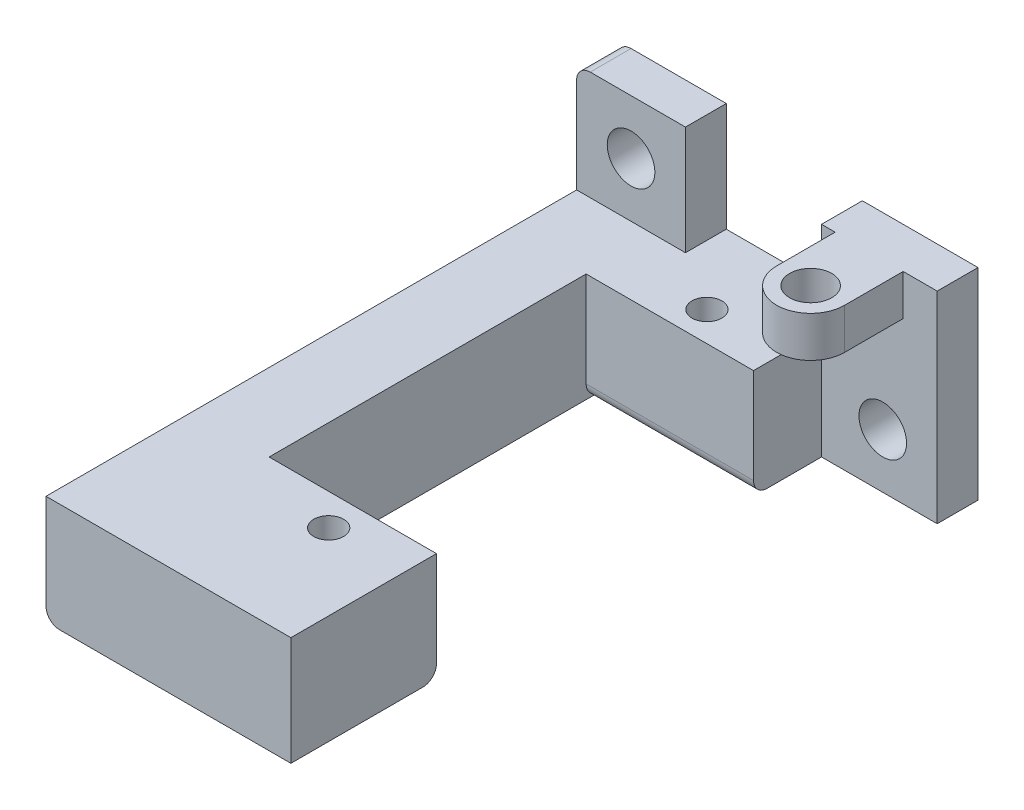
ISO-10303-21;
HEADER;
FILE_DESCRIPTION(('STEP AP214'),'2;1');
FILE_NAME('part.step','',(''),(''),'','','');
FILE_SCHEMA(('AUTOMOTIVE_DESIGN { 1 0 10303 214 1 1 1 1 }'));
ENDSEC;
DATA;
#1=APPLICATION_CONTEXT('core data for automotive mechanical design processes');
#2=APPLICATION_PROTOCOL_DEFINITION('international standard','automotive_design',2000,#1);
#3=PRODUCT_CONTEXT('',#1,'mechanical');
#4=PRODUCT('Part','Part','',(#3));
#5=PRODUCT_RELATED_PRODUCT_CATEGORY('part','',(#4));
#6=PRODUCT_DEFINITION_FORMATION('','',#4);
#7=PRODUCT_DEFINITION_CONTEXT('part definition',#1,'design');
#8=PRODUCT_DEFINITION('design','',#6,#7);
#9=PRODUCT_DEFINITION_SHAPE('','',#8);
#10=(LENGTH_UNIT() NAMED_UNIT(*) SI_UNIT(.MILLI.,.METRE.));
#11=(NAMED_UNIT(*) PLANE_ANGLE_UNIT() SI_UNIT($,.RADIAN.));
#12=(NAMED_UNIT(*) SI_UNIT($,.STERADIAN.) SOLID_ANGLE_UNIT());
#13=UNCERTAINTY_MEASURE_WITH_UNIT(LENGTH_MEASURE(1.E-05),#10,'distance_accuracy_value','');
#14=(GEOMETRIC_REPRESENTATION_CONTEXT(3) GLOBAL_UNCERTAINTY_ASSIGNED_CONTEXT((#13)) GLOBAL_UNIT_ASSIGNED_CONTEXT((#10,
#11,#12)) REPRESENTATION_CONTEXT('',''));
#15=CARTESIAN_POINT('',(0.,0.,0.));
#16=DIRECTION('',(0.,0.,1.));
#17=DIRECTION('',(1.,0.,0.));
#18=AXIS2_PLACEMENT_3D('',#15,#16,#17);
#19=CARTESIAN_POINT('',(0.,0.,-19.));
#20=DIRECTION('',(0.,0.,1.));
#21=DIRECTION('',(-1.,0.,0.));
#22=AXIS2_PLACEMENT_3D('',#19,#20,#21);
#23=PLANE('',#22);
#24=DIRECTION('',(0.,1.,0.));
#25=VECTOR('',#24,1.);
#26=CARTESIAN_POINT('',(17.5,-4.,-19.));
#27=LINE('',#26,#25);
#28=CARTESIAN_POINT('',(17.5,-4.,-19.));
#29=VERTEX_POINT('',#28);
#30=CARTESIAN_POINT('',(17.5,10.81,-19.));
#31=VERTEX_POINT('',#30);
#32=EDGE_CURVE('E213',#29,#31,#27,.T.);
#33=ORIENTED_EDGE('',*,*,#32,.T.);
#34=DIRECTION('',(1.,0.,0.));
#35=VECTOR('',#34,1.);
#36=CARTESIAN_POINT('',(20.,10.81,-19.));
#37=LINE('',#36,#35);
#38=CARTESIAN_POINT('',(15.,10.81,-19.));
#39=VERTEX_POINT('',#38);
#40=EDGE_CURVE('E201',#39,#31,#37,.T.);
#41=ORIENTED_EDGE('',*,*,#40,.F.);
#42=DIRECTION('',(0.,1.,0.));
#43=VECTOR('',#42,1.);
#44=CARTESIAN_POINT('',(15.,0.,-19.));
#45=LINE('',#44,#43);
#46=CARTESIAN_POINT('',(15.,7.81,-19.));
#47=VERTEX_POINT('',#46);
#48=EDGE_CURVE('E472',#47,#39,#45,.T.);
#49=ORIENTED_EDGE('',*,*,#48,.F.);
#50=DIRECTION('',(1.,0.,0.));
#51=VECTOR('',#50,1.);
#52=CARTESIAN_POINT('',(0.,7.81,-19.));
#53=LINE('',#52,#51);
#54=CARTESIAN_POINT('',(9.99999999999999,7.81,-19.));
#55=VERTEX_POINT('',#54);
#56=EDGE_CURVE('E231',#55,#47,#53,.T.);
#57=ORIENTED_EDGE('',*,*,#56,.F.);
#58=DIRECTION('',(0.,-1.,0.));
#59=VECTOR('',#58,1.);
#60=CARTESIAN_POINT('',(9.99999999999999,0.,-19.));
#61=LINE('',#60,#59);
#62=CARTESIAN_POINT('',(9.99999999999999,10.81,-19.));
#63=VERTEX_POINT('',#62);
#64=EDGE_CURVE('E475',#63,#55,#61,.T.);
#65=ORIENTED_EDGE('',*,*,#64,.F.);
#66=CARTESIAN_POINT('',(9.,10.81,-19.));
#67=VERTEX_POINT('',#66);
#68=EDGE_CURVE('E232',#67,#63,#37,.T.);
#69=ORIENTED_EDGE('',*,*,#68,.F.);
#70=DIRECTION('',(0.,1.,0.));
#71=VECTOR('',#70,1.);
#72=CARTESIAN_POINT('',(9.,4.,-19.));
#73=LINE('',#72,#71);
#74=CARTESIAN_POINT('',(9.,4.,-19.));
#75=VERTEX_POINT('',#74);
#76=EDGE_CURVE('E228',#75,#67,#73,.T.);
#77=ORIENTED_EDGE('',*,*,#76,.F.);
#78=DIRECTION('',(0.,-1.,0.));
#79=VECTOR('',#78,1.);
#80=CARTESIAN_POINT('',(9.,4.,-19.));
#81=LINE('',#80,#79);
#82=CARTESIAN_POINT('',(9.,-4.,-19.));
#83=VERTEX_POINT('',#82);
#84=EDGE_CURVE('E266',#75,#83,#81,.T.);
#85=ORIENTED_EDGE('',*,*,#84,.T.);
#86=DIRECTION('',(1.,0.,0.));
#87=VECTOR('',#86,1.);
#88=CARTESIAN_POINT('',(-9.,-4.,-19.));
#89=LINE('',#88,#87);
#90=EDGE_CURVE('E255',#83,#29,#89,.T.);
#91=ORIENTED_EDGE('',*,*,#90,.T.);
#92=EDGE_LOOP('',(#33,#41,#49,#57,#65,#69,#77,#85,#91));
#93=FACE_BOUND('',#92,.T.);
#94=CARTESIAN_POINT('',(13.5,0.,-19.));
#95=DIRECTION('',(0.,0.,-1.));
#96=DIRECTION('',(-1.,0.,0.));
#97=AXIS2_PLACEMENT_3D('',#94,#95,#96);
#98=CIRCLE('',#97,1.75);
#99=CARTESIAN_POINT('',(11.75,0.,-19.));
#100=VERTEX_POINT('',#99);
#101=EDGE_CURVE('E429',#100,#100,#98,.T.);
#102=ORIENTED_EDGE('',*,*,#101,.T.);
#103=EDGE_LOOP('',(#102));
#104=FACE_BOUND('',#103,.T.);
#105=ADVANCED_FACE('F39',(#93,#104),#23,.T.);
#106=CARTESIAN_POINT('',(0.,4.,-14.));
#107=DIRECTION('',(0.,0.,-1.));
#108=DIRECTION('',(1.,0.,0.));
#109=AXIS2_PLACEMENT_3D('',#106,#107,#108);
#110=PLANE('',#109);
#111=DIRECTION('',(0.,-1.,0.));
#112=VECTOR('',#111,1.);
#113=CARTESIAN_POINT('',(9.,4.,-14.));
#114=LINE('',#113,#112);
#115=CARTESIAN_POINT('',(9.,4.,-14.));
#116=VERTEX_POINT('',#115);
#117=CARTESIAN_POINT('',(9.,-3.,-14.));
#118=VERTEX_POINT('',#117);
#119=EDGE_CURVE('E294',#116,#118,#114,.T.);
#120=ORIENTED_EDGE('',*,*,#119,.F.);
#121=DIRECTION('',(-1.,0.,0.));
#122=VECTOR('',#121,1.);
#123=CARTESIAN_POINT('',(0.,4.,-14.));
#124=LINE('',#123,#122);
#125=CARTESIAN_POINT('',(-3.3,4.,-14.));
#126=VERTEX_POINT('',#125);
#127=EDGE_CURVE('E270',#116,#126,#124,.T.);
#128=ORIENTED_EDGE('',*,*,#127,.T.);
#129=DIRECTION('',(0.,-1.,0.));
#130=VECTOR('',#129,1.);
#131=CARTESIAN_POINT('',(-3.3,4.,-14.));
#132=LINE('',#131,#130);
#133=CARTESIAN_POINT('',(-3.3,-3.,-14.));
#134=VERTEX_POINT('',#133);
#135=EDGE_CURVE('E308',#126,#134,#132,.T.);
#136=ORIENTED_EDGE('',*,*,#135,.T.);
#137=DIRECTION('',(-1.,0.,0.));
#138=VECTOR('',#137,1.);
#139=CARTESIAN_POINT('',(0.,-3.,-14.));
#140=LINE('',#139,#138);
#141=EDGE_CURVE('E331',#118,#134,#140,.T.);
#142=ORIENTED_EDGE('',*,*,#141,.F.);
#143=EDGE_LOOP('',(#120,#128,#136,#142));
#144=FACE_BOUND('',#143,.T.);
#145=ADVANCED_FACE('F361',(#144),#110,.F.);
#146=CARTESIAN_POINT('',(-3.3,4.,0.));
#147=DIRECTION('',(-1.,0.,0.));
#148=DIRECTION('',(0.,0.,-1.));
#149=AXIS2_PLACEMENT_3D('',#146,#147,#148);
#150=PLANE('',#149);
#151=DIRECTION('',(0.,0.,1.));
#152=VECTOR('',#151,1.);
#153=CARTESIAN_POINT('',(-3.3,-4.,0.));
#154=LINE('',#153,#152);
#155=CARTESIAN_POINT('',(-3.3,-4.,-15.));
#156=VERTEX_POINT('',#155);
#157=CARTESIAN_POINT('',(-3.3,-4.,10.3));
#158=VERTEX_POINT('',#157);
#159=EDGE_CURVE('E269',#156,#158,#154,.T.);
#160=ORIENTED_EDGE('',*,*,#159,.F.);
#161=CARTESIAN_POINT('',(-3.3,-3.,-15.));
#162=DIRECTION('',(1.,0.,0.));
#163=DIRECTION('',(0.,0.,-1.));
#164=AXIS2_PLACEMENT_3D('',#161,#162,#163);
#165=CIRCLE('',#164,1.);
#166=EDGE_CURVE('E47',#134,#156,#165,.T.);
#167=ORIENTED_EDGE('',*,*,#166,.F.);
#168=ORIENTED_EDGE('',*,*,#135,.F.);
#169=DIRECTION('',(0.,0.,1.));
#170=VECTOR('',#169,1.);
#171=CARTESIAN_POINT('',(-3.3,4.,0.));
#172=LINE('',#171,#170);
#173=CARTESIAN_POINT('',(-3.3,4.,9.3));
#174=VERTEX_POINT('',#173);
#175=EDGE_CURVE('E273',#126,#174,#172,.T.);
#176=ORIENTED_EDGE('',*,*,#175,.T.);
#177=DIRECTION('',(0.,-1.,0.));
#178=VECTOR('',#177,1.);
#179=CARTESIAN_POINT('',(-3.3,4.,9.3));
#180=LINE('',#179,#178);
#181=CARTESIAN_POINT('',(-3.3,-3.,9.3));
#182=VERTEX_POINT('',#181);
#183=EDGE_CURVE('E305',#174,#182,#180,.T.);
#184=ORIENTED_EDGE('',*,*,#183,.T.);
#185=CARTESIAN_POINT('',(-3.3,-3.,10.3));
#186=DIRECTION('',(1.,0.,0.));
#187=DIRECTION('',(0.,0.,-1.));
#188=AXIS2_PLACEMENT_3D('',#185,#186,#187);
#189=CIRCLE('',#188,1.);
#190=EDGE_CURVE('E11',#158,#182,#189,.T.);
#191=ORIENTED_EDGE('',*,*,#190,.F.);
#192=EDGE_LOOP('',(#160,#167,#168,#176,#184,#191));
#193=FACE_BOUND('',#192,.T.);
#194=ADVANCED_FACE('F350',(#193),#150,.F.);
#195=CARTESIAN_POINT('',(0.,4.,9.3));
#196=DIRECTION('',(0.,0.,-1.));
#197=DIRECTION('',(1.,0.,0.));
#198=AXIS2_PLACEMENT_3D('',#195,#196,#197);
#199=PLANE('',#198);
#200=ORIENTED_EDGE('',*,*,#183,.F.);
#201=DIRECTION('',(-1.,0.,0.));
#202=VECTOR('',#201,1.);
#203=CARTESIAN_POINT('',(0.,4.,9.3));
#204=LINE('',#203,#202);
#205=CARTESIAN_POINT('',(9.,4.,9.3));
#206=VERTEX_POINT('',#205);
#207=EDGE_CURVE('E277',#206,#174,#204,.T.);
#208=ORIENTED_EDGE('',*,*,#207,.F.);
#209=DIRECTION('',(0.,-1.,0.));
#210=VECTOR('',#209,1.);
#211=CARTESIAN_POINT('',(9.,4.,9.3));
#212=LINE('',#211,#210);
#213=CARTESIAN_POINT('',(9.,-3.,9.3));
#214=VERTEX_POINT('',#213);
#215=EDGE_CURVE('E303',#206,#214,#212,.T.);
#216=ORIENTED_EDGE('',*,*,#215,.T.);
#217=DIRECTION('',(-1.,0.,0.));
#218=VECTOR('',#217,1.);
#219=CARTESIAN_POINT('',(9.,-3.,9.3));
#220=LINE('',#219,#218);
#221=EDGE_CURVE('E54',#182,#214,#220,.F.);
#222=ORIENTED_EDGE('',*,*,#221,.F.);
#223=EDGE_LOOP('',(#200,#208,#216,#222));
#224=FACE_BOUND('',#223,.T.);
#225=ADVANCED_FACE('F368',(#224),#199,.T.);
#226=CARTESIAN_POINT('',(9.,4.,0.));
#227=DIRECTION('',(-1.,0.,0.));
#228=DIRECTION('',(0.,0.,-1.));
#229=AXIS2_PLACEMENT_3D('',#226,#227,#228);
#230=PLANE('',#229);
#231=ORIENTED_EDGE('',*,*,#215,.F.);
#232=DIRECTION('',(0.,0.,1.));
#233=VECTOR('',#232,1.);
#234=CARTESIAN_POINT('',(9.,4.,0.));
#235=LINE('',#234,#233);
#236=CARTESIAN_POINT('',(9.,4.,20.));
#237=VERTEX_POINT('',#236);
#238=EDGE_CURVE('E279',#206,#237,#235,.T.);
#239=ORIENTED_EDGE('',*,*,#238,.T.);
#240=DIRECTION('',(0.,-1.,0.));
#241=VECTOR('',#240,1.);
#242=CARTESIAN_POINT('',(9.,4.,20.));
#243=LINE('',#242,#241);
#244=CARTESIAN_POINT('',(9.,-4.,20.));
#245=VERTEX_POINT('',#244);
#246=EDGE_CURVE('E300',#237,#245,#243,.T.);
#247=ORIENTED_EDGE('',*,*,#246,.T.);
#248=DIRECTION('',(0.,0.,1.));
#249=VECTOR('',#248,1.);
#250=CARTESIAN_POINT('',(9.,-4.,0.));
#251=LINE('',#250,#249);
#252=CARTESIAN_POINT('',(9.,-4.,10.3));
#253=VERTEX_POINT('',#252);
#254=EDGE_CURVE('E289',#253,#245,#251,.T.);
#255=ORIENTED_EDGE('',*,*,#254,.F.);
#256=CARTESIAN_POINT('',(9.,-3.,10.3));
#257=DIRECTION('',(1.,0.,0.));
#258=DIRECTION('',(0.,0.,-1.));
#259=AXIS2_PLACEMENT_3D('',#256,#257,#258);
#260=CIRCLE('',#259,1.);
#261=EDGE_CURVE('E61',#214,#253,#260,.F.);
#262=ORIENTED_EDGE('',*,*,#261,.F.);
#263=EDGE_LOOP('',(#231,#239,#247,#255,#262));
#264=FACE_BOUND('',#263,.T.);
#265=ADVANCED_FACE('F370',(#264),#230,.F.);
#266=CARTESIAN_POINT('',(0.,4.,20.));
#267=DIRECTION('',(0.,0.,1.));
#268=DIRECTION('',(-1.,0.,0.));
#269=AXIS2_PLACEMENT_3D('',#266,#267,#268);
#270=PLANE('',#269);
#271=DIRECTION('',(1.,0.,0.));
#272=VECTOR('',#271,1.);
#273=CARTESIAN_POINT('',(0.,-4.,20.));
#274=LINE('',#273,#272);
#275=CARTESIAN_POINT('',(-8.,-4.,20.));
#276=VERTEX_POINT('',#275);
#277=EDGE_CURVE('E292',#276,#245,#274,.T.);
#278=ORIENTED_EDGE('',*,*,#277,.T.);
#279=ORIENTED_EDGE('',*,*,#246,.F.);
#280=DIRECTION('',(1.,0.,0.));
#281=VECTOR('',#280,1.);
#282=CARTESIAN_POINT('',(0.,4.,20.));
#283=LINE('',#282,#281);
#284=CARTESIAN_POINT('',(-9.,4.,20.));
#285=VERTEX_POINT('',#284);
#286=EDGE_CURVE('E282',#285,#237,#283,.T.);
#287=ORIENTED_EDGE('',*,*,#286,.F.);
#288=DIRECTION('',(0.,-1.,0.));
#289=VECTOR('',#288,1.);
#290=CARTESIAN_POINT('',(-9.,4.,20.));
#291=LINE('',#290,#289);
#292=CARTESIAN_POINT('',(-9.,-3.,20.));
#293=VERTEX_POINT('',#292);
#294=EDGE_CURVE('E297',#285,#293,#291,.T.);
#295=ORIENTED_EDGE('',*,*,#294,.T.);
#296=CARTESIAN_POINT('',(-8.,-3.,20.));
#297=DIRECTION('',(0.,0.,-1.));
#298=DIRECTION('',(-1.,0.,0.));
#299=AXIS2_PLACEMENT_3D('',#296,#297,#298);
#300=CIRCLE('',#299,1.);
#301=EDGE_CURVE('E313',#276,#293,#300,.T.);
#302=ORIENTED_EDGE('',*,*,#301,.F.);
#303=EDGE_LOOP('',(#278,#279,#287,#295,#302));
#304=FACE_BOUND('',#303,.T.);
#305=ADVANCED_FACE('F376',(#304),#270,.T.);
#306=CARTESIAN_POINT('',(-9.,4.,0.));
#307=DIRECTION('',(-1.,0.,0.));
#308=DIRECTION('',(0.,0.,-1.));
#309=AXIS2_PLACEMENT_3D('',#306,#307,#308);
#310=PLANE('',#309);
#311=ORIENTED_EDGE('',*,*,#294,.F.);
#312=DIRECTION('',(0.,0.,1.));
#313=VECTOR('',#312,1.);
#314=CARTESIAN_POINT('',(-9.,4.,0.));
#315=LINE('',#314,#313);
#316=CARTESIAN_POINT('',(-9.,4.,-19.));
#317=VERTEX_POINT('',#316);
#318=EDGE_CURVE('E285',#317,#285,#315,.T.);
#319=ORIENTED_EDGE('',*,*,#318,.F.);
#320=DIRECTION('',(0.,-1.,0.));
#321=VECTOR('',#320,1.);
#322=CARTESIAN_POINT('',(-9.,-4.,-19.));
#323=LINE('',#322,#321);
#324=CARTESIAN_POINT('',(-9.,11.,-19.));
#325=VERTEX_POINT('',#324);
#326=EDGE_CURVE('E252',#325,#317,#323,.T.);
#327=ORIENTED_EDGE('',*,*,#326,.F.);
#328=DIRECTION('',(0.,0.,-1.));
#329=VECTOR('',#328,1.);
#330=CARTESIAN_POINT('',(-9.,11.,0.));
#331=LINE('',#330,#329);
#332=CARTESIAN_POINT('',(-9.,11.,-22.));
#333=VERTEX_POINT('',#332);
#334=EDGE_CURVE('E316',#333,#325,#331,.F.);
#335=ORIENTED_EDGE('',*,*,#334,.F.);
#336=DIRECTION('',(0.,-1.,0.));
#337=VECTOR('',#336,1.);
#338=CARTESIAN_POINT('',(-9.,-4.,-22.));
#339=LINE('',#338,#337);
#340=CARTESIAN_POINT('',(-9.,-3.,-22.));
#341=VERTEX_POINT('',#340);
#342=EDGE_CURVE('E242',#333,#341,#339,.T.);
#343=ORIENTED_EDGE('',*,*,#342,.T.);
#344=DIRECTION('',(0.,0.,1.));
#345=VECTOR('',#344,1.);
#346=CARTESIAN_POINT('',(-9.,-3.,-22.));
#347=LINE('',#346,#345);
#348=EDGE_CURVE('E319',#293,#341,#347,.F.);
#349=ORIENTED_EDGE('',*,*,#348,.F.);
#350=EDGE_LOOP('',(#311,#319,#327,#335,#343,#349));
#351=FACE_BOUND('',#350,.T.);
#352=ADVANCED_FACE('F413',(#351),#310,.T.);
#353=CARTESIAN_POINT('',(9.,-4.,-15.));
#354=VERTEX_POINT('',#353);
#355=EDGE_CURVE('E274',#83,#354,#251,.T.);
#356=ORIENTED_EDGE('',*,*,#355,.F.);
#357=ORIENTED_EDGE('',*,*,#84,.F.);
#358=EDGE_CURVE('E283',#75,#116,#235,.T.);
#359=ORIENTED_EDGE('',*,*,#358,.T.);
#360=ORIENTED_EDGE('',*,*,#119,.T.);
#361=CARTESIAN_POINT('',(9.,-3.,-15.));
#362=DIRECTION('',(1.,0.,0.));
#363=DIRECTION('',(0.,0.,-1.));
#364=AXIS2_PLACEMENT_3D('',#361,#362,#363);
#365=CIRCLE('',#364,1.);
#366=EDGE_CURVE('E338',#354,#118,#365,.F.);
#367=ORIENTED_EDGE('',*,*,#366,.F.);
#368=EDGE_LOOP('',(#356,#357,#359,#360,#367));
#369=FACE_BOUND('',#368,.T.);
#370=ADVANCED_FACE('F357',(#369),#230,.F.);
#371=CARTESIAN_POINT('',(0.,4.,0.));
#372=DIRECTION('',(0.,1.,0.));
#373=DIRECTION('',(0.,0.,-1.));
#374=AXIS2_PLACEMENT_3D('',#371,#372,#373);
#375=PLANE('',#374);
#376=CARTESIAN_POINT('',(3.4,4.,11.6230588166172));
#377=DIRECTION('',(0.,-1.,0.));
#378=DIRECTION('',(0.,0.,-1.));
#379=AXIS2_PLACEMENT_3D('',#376,#377,#378);
#380=CIRCLE('',#379,1.1);
#381=CARTESIAN_POINT('',(3.4,4.,10.5230588166172));
#382=VERTEX_POINT('',#381);
#383=EDGE_CURVE('E431',#382,#382,#380,.T.);
#384=ORIENTED_EDGE('',*,*,#383,.T.);
#385=EDGE_LOOP('',(#384));
#386=FACE_BOUND('',#385,.T.);
#387=CARTESIAN_POINT('',(3.4,4.,-16.1769411833828));
#388=DIRECTION('',(0.,-1.,0.));
#389=DIRECTION('',(0.,0.,-1.));
#390=AXIS2_PLACEMENT_3D('',#387,#388,#389);
#391=CIRCLE('',#390,1.1);
#392=CARTESIAN_POINT('',(3.4,4.,-17.2769411833828));
#393=VERTEX_POINT('',#392);
#394=EDGE_CURVE('E434',#393,#393,#391,.T.);
#395=ORIENTED_EDGE('',*,*,#394,.T.);
#396=EDGE_LOOP('',(#395));
#397=FACE_BOUND('',#396,.T.);
#398=DIRECTION('',(0.,0.,1.));
#399=VECTOR('',#398,1.);
#400=CARTESIAN_POINT('',(9.,4.,-34.9373915454391));
#401=LINE('',#400,#399);
#402=CARTESIAN_POINT('',(9.,4.,-22.));
#403=VERTEX_POINT('',#402);
#404=EDGE_CURVE('E235',#403,#75,#401,.T.);
#405=ORIENTED_EDGE('',*,*,#404,.F.);
#406=DIRECTION('',(-1.,0.,0.));
#407=VECTOR('',#406,1.);
#408=CARTESIAN_POINT('',(-1.,4.,-22.));
#409=LINE('',#408,#407);
#410=CARTESIAN_POINT('',(-1.,4.,-22.));
#411=VERTEX_POINT('',#410);
#412=EDGE_CURVE('E219',#403,#411,#409,.T.);
#413=ORIENTED_EDGE('',*,*,#412,.T.);
#414=DIRECTION('',(0.,0.,-1.));
#415=VECTOR('',#414,1.);
#416=CARTESIAN_POINT('',(-1.,4.,-19.));
#417=LINE('',#416,#415);
#418=CARTESIAN_POINT('',(-1.,4.,-19.));
#419=VERTEX_POINT('',#418);
#420=EDGE_CURVE('E258',#419,#411,#417,.T.);
#421=ORIENTED_EDGE('',*,*,#420,.F.);
#422=DIRECTION('',(-1.,0.,0.));
#423=VECTOR('',#422,1.);
#424=CARTESIAN_POINT('',(0.,4.,-19.));
#425=LINE('',#424,#423);
#426=EDGE_CURVE('E262',#419,#317,#425,.T.);
#427=ORIENTED_EDGE('',*,*,#426,.T.);
#428=ORIENTED_EDGE('',*,*,#318,.T.);
#429=ORIENTED_EDGE('',*,*,#286,.T.);
#430=ORIENTED_EDGE('',*,*,#238,.F.);
#431=ORIENTED_EDGE('',*,*,#207,.T.);
#432=ORIENTED_EDGE('',*,*,#175,.F.);
#433=ORIENTED_EDGE('',*,*,#127,.F.);
#434=ORIENTED_EDGE('',*,*,#358,.F.);
#435=EDGE_LOOP('',(#405,#413,#421,#427,#428,#429,#430,#431,#432,#433,#434));
#436=FACE_BOUND('',#435,.T.);
#437=ADVANCED_FACE('F365',(#386,#397,#436),#375,.T.);
#438=CARTESIAN_POINT('',(0.,-4.,0.));
#439=DIRECTION('',(0.,1.,0.));
#440=DIRECTION('',(0.,0.,-1.));
#441=AXIS2_PLACEMENT_3D('',#438,#439,#440);
#442=PLANE('',#441);
#443=CARTESIAN_POINT('',(3.4,-4.,11.6230588166172));
#444=DIRECTION('',(0.,1.,0.));
#445=DIRECTION('',(0.,0.,1.));
#446=AXIS2_PLACEMENT_3D('',#443,#444,#445);
#447=CIRCLE('',#446,1.1);
#448=CARTESIAN_POINT('',(3.4,-4.,12.7230588166172));
#449=VERTEX_POINT('',#448);
#450=EDGE_CURVE('E539',#449,#449,#447,.T.);
#451=ORIENTED_EDGE('',*,*,#450,.T.);
#452=EDGE_LOOP('',(#451));
#453=FACE_BOUND('',#452,.T.);
#454=CARTESIAN_POINT('',(3.4,-4.,-16.1769411833828));
#455=DIRECTION('',(0.,1.,0.));
#456=DIRECTION('',(0.,0.,1.));
#457=AXIS2_PLACEMENT_3D('',#454,#455,#456);
#458=CIRCLE('',#457,1.1);
#459=CARTESIAN_POINT('',(3.4,-4.,-15.0769411833828));
#460=VERTEX_POINT('',#459);
#461=EDGE_CURVE('E541',#460,#460,#458,.T.);
#462=ORIENTED_EDGE('',*,*,#461,.T.);
#463=EDGE_LOOP('',(#462));
#464=FACE_BOUND('',#463,.T.);
#465=ORIENTED_EDGE('',*,*,#159,.T.);
#466=DIRECTION('',(-1.,0.,0.));
#467=VECTOR('',#466,1.);
#468=CARTESIAN_POINT('',(-3.3,-4.,10.3));
#469=LINE('',#468,#467);
#470=EDGE_CURVE('E334',#253,#158,#469,.T.);
#471=ORIENTED_EDGE('',*,*,#470,.F.);
#472=ORIENTED_EDGE('',*,*,#254,.T.);
#473=ORIENTED_EDGE('',*,*,#277,.F.);
#474=DIRECTION('',(0.,0.,1.));
#475=VECTOR('',#474,1.);
#476=CARTESIAN_POINT('',(-8.,-4.,20.));
#477=LINE('',#476,#475);
#478=CARTESIAN_POINT('',(-8.,-4.,-22.));
#479=VERTEX_POINT('',#478);
#480=EDGE_CURVE('E311',#479,#276,#477,.T.);
#481=ORIENTED_EDGE('',*,*,#480,.F.);
#482=DIRECTION('',(1.,0.,0.));
#483=VECTOR('',#482,1.);
#484=CARTESIAN_POINT('',(-9.,-4.,-22.));
#485=LINE('',#484,#483);
#486=CARTESIAN_POINT('',(17.5,-4.,-22.));
#487=VERTEX_POINT('',#486);
#488=EDGE_CURVE('E245',#479,#487,#485,.T.);
#489=ORIENTED_EDGE('',*,*,#488,.T.);
#490=DIRECTION('',(0.,0.,1.));
#491=VECTOR('',#490,1.);
#492=CARTESIAN_POINT('',(17.5,-4.,-22.));
#493=LINE('',#492,#491);
#494=EDGE_CURVE('E205',#487,#29,#493,.T.);
#495=ORIENTED_EDGE('',*,*,#494,.T.);
#496=ORIENTED_EDGE('',*,*,#90,.F.);
#497=ORIENTED_EDGE('',*,*,#355,.T.);
#498=DIRECTION('',(-1.,0.,0.));
#499=VECTOR('',#498,1.);
#500=CARTESIAN_POINT('',(0.,-4.,-15.));
#501=LINE('',#500,#499);
#502=EDGE_CURVE('E336',#156,#354,#501,.F.);
#503=ORIENTED_EDGE('',*,*,#502,.F.);
#504=EDGE_LOOP('',(#465,#471,#472,#473,#481,#489,#495,#496,#497,#503));
#505=FACE_BOUND('',#504,.T.);
#506=ADVANCED_FACE('F352',(#453,#464,#505),#442,.F.);
#507=CARTESIAN_POINT('',(-9.,12.,-19.));
#508=DIRECTION('',(0.,1.,0.));
#509=DIRECTION('',(0.,0.,-1.));
#510=AXIS2_PLACEMENT_3D('',#507,#508,#509);
#511=PLANE('',#510);
#512=DIRECTION('',(-1.,0.,0.));
#513=VECTOR('',#512,1.);
#514=CARTESIAN_POINT('',(-9.,12.,-19.));
#515=LINE('',#514,#513);
#516=CARTESIAN_POINT('',(-1.,12.,-19.));
#517=VERTEX_POINT('',#516);
#518=CARTESIAN_POINT('',(-8.,12.,-19.));
#519=VERTEX_POINT('',#518);
#520=EDGE_CURVE('E249',#517,#519,#515,.T.);
#521=ORIENTED_EDGE('',*,*,#520,.F.);
#522=DIRECTION('',(0.,0.,-1.));
#523=VECTOR('',#522,1.);
#524=CARTESIAN_POINT('',(-1.,12.,-19.));
#525=LINE('',#524,#523);
#526=CARTESIAN_POINT('',(-1.,12.,-22.));
#527=VERTEX_POINT('',#526);
#528=EDGE_CURVE('E259',#517,#527,#525,.T.);
#529=ORIENTED_EDGE('',*,*,#528,.T.);
#530=DIRECTION('',(-1.,0.,0.));
#531=VECTOR('',#530,1.);
#532=CARTESIAN_POINT('',(-9.,12.,-22.));
#533=LINE('',#532,#531);
#534=CARTESIAN_POINT('',(-8.,12.,-22.));
#535=VERTEX_POINT('',#534);
#536=EDGE_CURVE('E239',#527,#535,#533,.T.);
#537=ORIENTED_EDGE('',*,*,#536,.T.);
#538=DIRECTION('',(0.,0.,-1.));
#539=VECTOR('',#538,1.);
#540=CARTESIAN_POINT('',(-8.,12.,-19.));
#541=LINE('',#540,#539);
#542=EDGE_CURVE('E326',#519,#535,#541,.T.);
#543=ORIENTED_EDGE('',*,*,#542,.F.);
#544=EDGE_LOOP('',(#521,#529,#537,#543));
#545=FACE_BOUND('',#544,.T.);
#546=ADVANCED_FACE('F399',(#545),#511,.T.);
#547=CARTESIAN_POINT('',(-1.,4.,-19.));
#548=DIRECTION('',(1.,0.,0.));
#549=DIRECTION('',(0.,0.,1.));
#550=AXIS2_PLACEMENT_3D('',#547,#548,#549);
#551=PLANE('',#550);
#552=ORIENTED_EDGE('',*,*,#528,.F.);
#553=DIRECTION('',(0.,1.,0.));
#554=VECTOR('',#553,1.);
#555=CARTESIAN_POINT('',(-1.,4.,-19.));
#556=LINE('',#555,#554);
#557=EDGE_CURVE('E247',#419,#517,#556,.T.);
#558=ORIENTED_EDGE('',*,*,#557,.F.);
#559=ORIENTED_EDGE('',*,*,#420,.T.);
#560=DIRECTION('',(0.,1.,0.));
#561=VECTOR('',#560,1.);
#562=CARTESIAN_POINT('',(-1.,4.,-22.));
#563=LINE('',#562,#561);
#564=EDGE_CURVE('E222',#411,#527,#563,.T.);
#565=ORIENTED_EDGE('',*,*,#564,.T.);
#566=EDGE_LOOP('',(#552,#558,#559,#565));
#567=FACE_BOUND('',#566,.T.);
#568=ADVANCED_FACE('F392',(#567),#551,.T.);
#569=CARTESIAN_POINT('',(-5.,8.,-19.));
#570=DIRECTION('',(0.,0.,-1.));
#571=DIRECTION('',(-1.,0.,0.));
#572=AXIS2_PLACEMENT_3D('',#569,#570,#571);
#573=CIRCLE('',#572,1.75);
#574=CARTESIAN_POINT('',(-6.75,8.,-19.));
#575=VERTEX_POINT('',#574);
#576=EDGE_CURVE('E405',#575,#575,#573,.T.);
#577=ORIENTED_EDGE('',*,*,#576,.T.);
#578=EDGE_LOOP('',(#577));
#579=FACE_BOUND('',#578,.T.);
#580=ORIENTED_EDGE('',*,*,#326,.T.);
#581=ORIENTED_EDGE('',*,*,#426,.F.);
#582=ORIENTED_EDGE('',*,*,#557,.T.);
#583=ORIENTED_EDGE('',*,*,#520,.T.);
#584=CARTESIAN_POINT('',(-8.,11.,-19.));
#585=DIRECTION('',(0.,0.,-1.));
#586=DIRECTION('',(-1.,0.,0.));
#587=AXIS2_PLACEMENT_3D('',#584,#585,#586);
#588=CIRCLE('',#587,1.);
#589=EDGE_CURVE('E329',#325,#519,#588,.T.);
#590=ORIENTED_EDGE('',*,*,#589,.F.);
#591=EDGE_LOOP('',(#580,#581,#582,#583,#590));
#592=FACE_BOUND('',#591,.T.);
#593=ADVANCED_FACE('F383',(#579,#592),#23,.T.);
#594=CARTESIAN_POINT('',(0.,0.,-22.));
#595=DIRECTION('',(0.,0.,1.));
#596=DIRECTION('',(-1.,0.,0.));
#597=AXIS2_PLACEMENT_3D('',#594,#595,#596);
#598=PLANE('',#597);
#599=CARTESIAN_POINT('',(-5.,8.,-22.));
#600=DIRECTION('',(0.,0.,-1.));
#601=DIRECTION('',(-1.,0.,0.));
#602=AXIS2_PLACEMENT_3D('',#599,#600,#601);
#603=CIRCLE('',#602,1.75);
#604=CARTESIAN_POINT('',(-6.75,8.,-22.));
#605=VERTEX_POINT('',#604);
#606=EDGE_CURVE('E437',#605,#605,#603,.T.);
#607=ORIENTED_EDGE('',*,*,#606,.F.);
#608=EDGE_LOOP('',(#607));
#609=FACE_BOUND('',#608,.T.);
#610=CARTESIAN_POINT('',(13.5,0.,-22.));
#611=DIRECTION('',(0.,0.,-1.));
#612=DIRECTION('',(-1.,0.,0.));
#613=AXIS2_PLACEMENT_3D('',#610,#611,#612);
#614=CIRCLE('',#613,1.75);
#615=CARTESIAN_POINT('',(11.75,0.,-22.));
#616=VERTEX_POINT('',#615);
#617=EDGE_CURVE('E442',#616,#616,#614,.T.);
#618=ORIENTED_EDGE('',*,*,#617,.F.);
#619=EDGE_LOOP('',(#618));
#620=FACE_BOUND('',#619,.T.);
#621=ORIENTED_EDGE('',*,*,#342,.F.);
#622=CARTESIAN_POINT('',(-8.,11.,-22.));
#623=DIRECTION('',(0.,0.,-1.));
#624=DIRECTION('',(-1.,0.,0.));
#625=AXIS2_PLACEMENT_3D('',#622,#623,#624);
#626=CIRCLE('',#625,1.);
#627=EDGE_CURVE('E322',#535,#333,#626,.F.);
#628=ORIENTED_EDGE('',*,*,#627,.F.);
#629=ORIENTED_EDGE('',*,*,#536,.F.);
#630=ORIENTED_EDGE('',*,*,#564,.F.);
#631=ORIENTED_EDGE('',*,*,#412,.F.);
#632=DIRECTION('',(0.,-1.,0.));
#633=VECTOR('',#632,1.);
#634=CARTESIAN_POINT('',(9.,4.,-22.));
#635=LINE('',#634,#633);
#636=CARTESIAN_POINT('',(9.,10.81,-22.));
#637=VERTEX_POINT('',#636);
#638=EDGE_CURVE('E218',#637,#403,#635,.T.);
#639=ORIENTED_EDGE('',*,*,#638,.F.);
#640=DIRECTION('',(-1.,0.,0.));
#641=VECTOR('',#640,1.);
#642=CARTESIAN_POINT('',(20.,10.81,-22.));
#643=LINE('',#642,#641);
#644=CARTESIAN_POINT('',(17.5,10.81,-22.));
#645=VERTEX_POINT('',#644);
#646=EDGE_CURVE('E198',#645,#637,#643,.T.);
#647=ORIENTED_EDGE('',*,*,#646,.F.);
#648=DIRECTION('',(0.,1.,0.));
#649=VECTOR('',#648,1.);
#650=CARTESIAN_POINT('',(17.5,-4.,-22.));
#651=LINE('',#650,#649);
#652=EDGE_CURVE('E206',#487,#645,#651,.T.);
#653=ORIENTED_EDGE('',*,*,#652,.F.);
#654=ORIENTED_EDGE('',*,*,#488,.F.);
#655=CARTESIAN_POINT('',(-8.,-3.,-22.));
#656=DIRECTION('',(0.,0.,-1.));
#657=DIRECTION('',(-1.,0.,0.));
#658=AXIS2_PLACEMENT_3D('',#655,#656,#657);
#659=CIRCLE('',#658,1.);
#660=EDGE_CURVE('E324',#341,#479,#659,.F.);
#661=ORIENTED_EDGE('',*,*,#660,.F.);
#662=EDGE_LOOP('',(#621,#628,#629,#630,#631,#639,#647,#653,#654,#661));
#663=FACE_BOUND('',#662,.T.);
#664=ADVANCED_FACE('F216',(#609,#620,#663),#598,.F.);
#665=CARTESIAN_POINT('',(20.,10.81,-34.9373915454391));
#666=DIRECTION('',(0.,1.,0.));
#667=DIRECTION('',(0.,0.,-1.));
#668=AXIS2_PLACEMENT_3D('',#665,#666,#667);
#669=PLANE('',#668);
#670=DIRECTION('',(0.,0.,1.));
#671=VECTOR('',#670,1.);
#672=CARTESIAN_POINT('',(17.5,10.81,-22.));
#673=LINE('',#672,#671);
#674=EDGE_CURVE('E193',#645,#31,#673,.T.);
#675=ORIENTED_EDGE('',*,*,#674,.F.);
#676=ORIENTED_EDGE('',*,*,#646,.T.);
#677=DIRECTION('',(0.,0.,1.));
#678=VECTOR('',#677,1.);
#679=CARTESIAN_POINT('',(9.,10.81,-34.9373915454391));
#680=LINE('',#679,#678);
#681=EDGE_CURVE('E224',#637,#67,#680,.T.);
#682=ORIENTED_EDGE('',*,*,#681,.T.);
#683=ORIENTED_EDGE('',*,*,#68,.T.);
#684=DIRECTION('',(0.,0.,-1.));
#685=VECTOR('',#684,1.);
#686=CARTESIAN_POINT('',(9.99999999999999,10.81,-14.7));
#687=LINE('',#686,#685);
#688=CARTESIAN_POINT('',(9.99999999999999,10.81,-14.7));
#689=VERTEX_POINT('',#688);
#690=EDGE_CURVE('E456',#689,#63,#687,.T.);
#691=ORIENTED_EDGE('',*,*,#690,.F.);
#692=CARTESIAN_POINT('',(12.5,10.81,-14.7));
#693=DIRECTION('',(0.,-1.,0.));
#694=DIRECTION('',(0.,0.,-1.));
#695=AXIS2_PLACEMENT_3D('',#692,#693,#694);
#696=CIRCLE('',#695,2.5);
#697=CARTESIAN_POINT('',(15.,10.81,-14.7));
#698=VERTEX_POINT('',#697);
#699=EDGE_CURVE('E453',#698,#689,#696,.T.);
#700=ORIENTED_EDGE('',*,*,#699,.F.);
#701=DIRECTION('',(0.,0.,1.));
#702=VECTOR('',#701,1.);
#703=CARTESIAN_POINT('',(15.,10.81,-22.));
#704=LINE('',#703,#702);
#705=EDGE_CURVE('E459',#39,#698,#704,.T.);
#706=ORIENTED_EDGE('',*,*,#705,.F.);
#707=ORIENTED_EDGE('',*,*,#40,.T.);
#708=EDGE_LOOP('',(#675,#676,#682,#683,#691,#700,#706,#707));
#709=FACE_BOUND('',#708,.T.);
#710=CARTESIAN_POINT('',(12.5,10.81,-14.7));
#711=DIRECTION('',(0.,-1.,0.));
#712=DIRECTION('',(0.,0.,-1.));
#713=AXIS2_PLACEMENT_3D('',#710,#711,#712);
#714=CIRCLE('',#713,1.55);
#715=CARTESIAN_POINT('',(12.5,10.81,-16.25));
#716=VERTEX_POINT('',#715);
#717=EDGE_CURVE('E447',#716,#716,#714,.T.);
#718=ORIENTED_EDGE('',*,*,#717,.T.);
#719=EDGE_LOOP('',(#718));
#720=FACE_BOUND('',#719,.T.);
#721=ADVANCED_FACE('F195',(#709,#720),#669,.T.);
#722=CARTESIAN_POINT('',(9.,4.,-34.9373915454391));
#723=DIRECTION('',(-1.,0.,0.));
#724=DIRECTION('',(0.,0.,-1.));
#725=AXIS2_PLACEMENT_3D('',#722,#723,#724);
#726=PLANE('',#725);
#727=ORIENTED_EDGE('',*,*,#638,.T.);
#728=ORIENTED_EDGE('',*,*,#404,.T.);
#729=ORIENTED_EDGE('',*,*,#76,.T.);
#730=ORIENTED_EDGE('',*,*,#681,.F.);
#731=EDGE_LOOP('',(#727,#728,#729,#730));
#732=FACE_BOUND('',#731,.T.);
#733=ADVANCED_FACE('F496',(#732),#726,.T.);
#734=CARTESIAN_POINT('',(12.5,7.81,-14.7));
#735=DIRECTION('',(0.,1.,0.));
#736=DIRECTION('',(0.,0.,-1.));
#737=AXIS2_PLACEMENT_3D('',#734,#735,#736);
#738=PLANE('',#737);
#739=ORIENTED_EDGE('',*,*,#56,.T.);
#740=DIRECTION('',(0.,0.,1.));
#741=VECTOR('',#740,1.);
#742=CARTESIAN_POINT('',(15.,7.81,-22.));
#743=LINE('',#742,#741);
#744=CARTESIAN_POINT('',(15.,7.81,-14.7));
#745=VERTEX_POINT('',#744);
#746=EDGE_CURVE('E457',#47,#745,#743,.T.);
#747=ORIENTED_EDGE('',*,*,#746,.T.);
#748=CARTESIAN_POINT('',(12.5,7.81,-14.7));
#749=DIRECTION('',(0.,-1.,0.));
#750=DIRECTION('',(0.,0.,-1.));
#751=AXIS2_PLACEMENT_3D('',#748,#749,#750);
#752=CIRCLE('',#751,2.5);
#753=CARTESIAN_POINT('',(9.99999999999999,7.81,-14.7));
#754=VERTEX_POINT('',#753);
#755=EDGE_CURVE('E450',#745,#754,#752,.T.);
#756=ORIENTED_EDGE('',*,*,#755,.T.);
#757=DIRECTION('',(0.,0.,-1.));
#758=VECTOR('',#757,1.);
#759=CARTESIAN_POINT('',(9.99999999999999,7.81,-14.7));
#760=LINE('',#759,#758);
#761=EDGE_CURVE('E465',#754,#55,#760,.T.);
#762=ORIENTED_EDGE('',*,*,#761,.T.);
#763=EDGE_LOOP('',(#739,#747,#756,#762));
#764=FACE_BOUND('',#763,.T.);
#765=CARTESIAN_POINT('',(12.5,7.81,-14.7));
#766=DIRECTION('',(0.,-1.,0.));
#767=DIRECTION('',(0.,0.,-1.));
#768=AXIS2_PLACEMENT_3D('',#765,#766,#767);
#769=CIRCLE('',#768,1.55);
#770=CARTESIAN_POINT('',(12.5,7.81,-16.25));
#771=VERTEX_POINT('',#770);
#772=EDGE_CURVE('E440',#771,#771,#769,.T.);
#773=ORIENTED_EDGE('',*,*,#772,.F.);
#774=EDGE_LOOP('',(#773));
#775=FACE_BOUND('',#774,.T.);
#776=ADVANCED_FACE('F481',(#764,#775),#738,.F.);
#777=CARTESIAN_POINT('',(12.5,10.81,-14.7));
#778=DIRECTION('',(0.,-1.,0.));
#779=DIRECTION('',(0.,0.,1.));
#780=AXIS2_PLACEMENT_3D('',#777,#778,#779);
#781=CYLINDRICAL_SURFACE('',#780,2.5);
#782=ORIENTED_EDGE('',*,*,#755,.F.);
#783=DIRECTION('',(0.,-1.,0.));
#784=VECTOR('',#783,1.);
#785=CARTESIAN_POINT('',(15.,10.81,-14.7));
#786=LINE('',#785,#784);
#787=EDGE_CURVE('E462',#698,#745,#786,.T.);
#788=ORIENTED_EDGE('',*,*,#787,.F.);
#789=ORIENTED_EDGE('',*,*,#699,.T.);
#790=DIRECTION('',(0.,-1.,0.));
#791=VECTOR('',#790,1.);
#792=CARTESIAN_POINT('',(9.99999999999999,10.81,-14.7));
#793=LINE('',#792,#791);
#794=EDGE_CURVE('E470',#689,#754,#793,.T.);
#795=ORIENTED_EDGE('',*,*,#794,.T.);
#796=EDGE_LOOP('',(#782,#788,#789,#795));
#797=FACE_BOUND('',#796,.T.);
#798=ADVANCED_FACE('F490',(#797),#781,.T.);
#799=CARTESIAN_POINT('',(9.99999999999999,10.81,-14.7));
#800=DIRECTION('',(1.,0.,0.));
#801=DIRECTION('',(0.,0.,1.));
#802=AXIS2_PLACEMENT_3D('',#799,#800,#801);
#803=PLANE('',#802);
#804=ORIENTED_EDGE('',*,*,#64,.T.);
#805=ORIENTED_EDGE('',*,*,#761,.F.);
#806=ORIENTED_EDGE('',*,*,#794,.F.);
#807=ORIENTED_EDGE('',*,*,#690,.T.);
#808=EDGE_LOOP('',(#804,#805,#806,#807));
#809=FACE_BOUND('',#808,.T.);
#810=ADVANCED_FACE('F493',(#809),#803,.F.);
#811=CARTESIAN_POINT('',(15.,10.81,-22.));
#812=DIRECTION('',(-1.,0.,0.));
#813=DIRECTION('',(0.,0.,-1.));
#814=AXIS2_PLACEMENT_3D('',#811,#812,#813);
#815=PLANE('',#814);
#816=ORIENTED_EDGE('',*,*,#48,.T.);
#817=ORIENTED_EDGE('',*,*,#705,.T.);
#818=ORIENTED_EDGE('',*,*,#787,.T.);
#819=ORIENTED_EDGE('',*,*,#746,.F.);
#820=EDGE_LOOP('',(#816,#817,#818,#819));
#821=FACE_BOUND('',#820,.T.);
#822=ADVANCED_FACE('F486',(#821),#815,.F.);
#823=CARTESIAN_POINT('',(12.5,10.81,-14.7));
#824=DIRECTION('',(0.,-1.,0.));
#825=DIRECTION('',(0.,0.,1.));
#826=AXIS2_PLACEMENT_3D('',#823,#824,#825);
#827=CYLINDRICAL_SURFACE('',#826,1.55);
#828=ORIENTED_EDGE('',*,*,#717,.F.);
#829=EDGE_LOOP('',(#828));
#830=FACE_BOUND('',#829,.T.);
#831=ORIENTED_EDGE('',*,*,#772,.T.);
#832=EDGE_LOOP('',(#831));
#833=FACE_BOUND('',#832,.T.);
#834=ADVANCED_FACE('F511',(#830,#833),#827,.F.);
#835=CARTESIAN_POINT('',(13.5,0.,-22.));
#836=DIRECTION('',(0.,0.,1.));
#837=DIRECTION('',(-1.,0.,0.));
#838=AXIS2_PLACEMENT_3D('',#835,#836,#837);
#839=CYLINDRICAL_SURFACE('',#838,1.75);
#840=ORIENTED_EDGE('',*,*,#617,.T.);
#841=EDGE_LOOP('',(#840));
#842=FACE_BOUND('',#841,.T.);
#843=ORIENTED_EDGE('',*,*,#101,.F.);
#844=EDGE_LOOP('',(#843));
#845=FACE_BOUND('',#844,.T.);
#846=ADVANCED_FACE('F515',(#842,#845),#839,.F.);
#847=CARTESIAN_POINT('',(-5.,8.,-22.));
#848=DIRECTION('',(0.,0.,1.));
#849=DIRECTION('',(-1.,0.,0.));
#850=AXIS2_PLACEMENT_3D('',#847,#848,#849);
#851=CYLINDRICAL_SURFACE('',#850,1.75);
#852=ORIENTED_EDGE('',*,*,#606,.T.);
#853=EDGE_LOOP('',(#852));
#854=FACE_BOUND('',#853,.T.);
#855=ORIENTED_EDGE('',*,*,#576,.F.);
#856=EDGE_LOOP('',(#855));
#857=FACE_BOUND('',#856,.T.);
#858=ADVANCED_FACE('F519',(#854,#857),#851,.F.);
#859=CARTESIAN_POINT('',(17.5,-4.,-22.));
#860=DIRECTION('',(-1.,0.,0.));
#861=DIRECTION('',(0.,0.,-1.));
#862=AXIS2_PLACEMENT_3D('',#859,#860,#861);
#863=PLANE('',#862);
#864=ORIENTED_EDGE('',*,*,#32,.F.);
#865=ORIENTED_EDGE('',*,*,#494,.F.);
#866=ORIENTED_EDGE('',*,*,#652,.T.);
#867=ORIENTED_EDGE('',*,*,#674,.T.);
#868=EDGE_LOOP('',(#864,#865,#866,#867));
#869=FACE_BOUND('',#868,.T.);
#870=ADVANCED_FACE('F209',(#869),#863,.F.);
#871=CARTESIAN_POINT('',(-8.,-3.,0.));
#872=DIRECTION('',(0.,0.,-1.));
#873=DIRECTION('',(1.,0.,0.));
#874=AXIS2_PLACEMENT_3D('',#871,#872,#873);
#875=CYLINDRICAL_SURFACE('',#874,1.);
#876=ORIENTED_EDGE('',*,*,#660,.T.);
#877=ORIENTED_EDGE('',*,*,#480,.T.);
#878=ORIENTED_EDGE('',*,*,#301,.T.);
#879=ORIENTED_EDGE('',*,*,#348,.T.);
#880=EDGE_LOOP('',(#876,#877,#878,#879));
#881=FACE_BOUND('',#880,.T.);
#882=ADVANCED_FACE('F425',(#881),#875,.T.);
#883=CARTESIAN_POINT('',(-8.,11.,-19.));
#884=DIRECTION('',(0.,0.,-1.));
#885=DIRECTION('',(1.,0.,0.));
#886=AXIS2_PLACEMENT_3D('',#883,#884,#885);
#887=CYLINDRICAL_SURFACE('',#886,1.);
#888=ORIENTED_EDGE('',*,*,#589,.T.);
#889=ORIENTED_EDGE('',*,*,#542,.T.);
#890=ORIENTED_EDGE('',*,*,#627,.T.);
#891=ORIENTED_EDGE('',*,*,#334,.T.);
#892=EDGE_LOOP('',(#888,#889,#890,#891));
#893=FACE_BOUND('',#892,.T.);
#894=ADVANCED_FACE('F422',(#893),#887,.T.);
#895=CARTESIAN_POINT('',(0.,-3.,-15.));
#896=DIRECTION('',(-1.,0.,0.));
#897=DIRECTION('',(0.,0.,-1.));
#898=AXIS2_PLACEMENT_3D('',#895,#896,#897);
#899=CYLINDRICAL_SURFACE('',#898,1.);
#900=ORIENTED_EDGE('',*,*,#366,.T.);
#901=ORIENTED_EDGE('',*,*,#141,.T.);
#902=ORIENTED_EDGE('',*,*,#166,.T.);
#903=ORIENTED_EDGE('',*,*,#502,.T.);
#904=EDGE_LOOP('',(#900,#901,#902,#903));
#905=FACE_BOUND('',#904,.T.);
#906=ADVANCED_FACE('F344',(#905),#899,.T.);
#907=CARTESIAN_POINT('',(0.,-3.,10.3));
#908=DIRECTION('',(1.,0.,0.));
#909=DIRECTION('',(0.,0.,1.));
#910=AXIS2_PLACEMENT_3D('',#907,#908,#909);
#911=CYLINDRICAL_SURFACE('',#910,1.);
#912=ORIENTED_EDGE('',*,*,#261,.T.);
#913=ORIENTED_EDGE('',*,*,#470,.T.);
#914=ORIENTED_EDGE('',*,*,#190,.T.);
#915=ORIENTED_EDGE('',*,*,#221,.T.);
#916=EDGE_LOOP('',(#912,#913,#914,#915));
#917=FACE_BOUND('',#916,.T.);
#918=ADVANCED_FACE('F41',(#917),#911,.T.);
#919=CARTESIAN_POINT('',(3.4,12.,-16.1769411833828));
#920=DIRECTION('',(0.,-1.,0.));
#921=DIRECTION('',(0.,0.,1.));
#922=AXIS2_PLACEMENT_3D('',#919,#920,#921);
#923=CYLINDRICAL_SURFACE('',#922,1.1);
#924=ORIENTED_EDGE('',*,*,#394,.F.);
#925=EDGE_LOOP('',(#924));
#926=FACE_BOUND('',#925,.T.);
#927=ORIENTED_EDGE('',*,*,#461,.F.);
#928=EDGE_LOOP('',(#927));
#929=FACE_BOUND('',#928,.T.);
#930=ADVANCED_FACE('F526',(#926,#929),#923,.F.);
#931=CARTESIAN_POINT('',(3.4,12.,11.6230588166172));
#932=DIRECTION('',(0.,-1.,0.));
#933=DIRECTION('',(0.,0.,1.));
#934=AXIS2_PLACEMENT_3D('',#931,#932,#933);
#935=CYLINDRICAL_SURFACE('',#934,1.1);
#936=ORIENTED_EDGE('',*,*,#383,.F.);
#937=EDGE_LOOP('',(#936));
#938=FACE_BOUND('',#937,.T.);
#939=ORIENTED_EDGE('',*,*,#450,.F.);
#940=EDGE_LOOP('',(#939));
#941=FACE_BOUND('',#940,.T.);
#942=ADVANCED_FACE('F529',(#938,#941),#935,.F.);
#943=CLOSED_SHELL('',(#105,#145,#194,#225,#265,#305,#352,#370,#437,#506,#546,#568,#593,#664,
#721,#733,#776,#798,#810,#822,#834,#846,#858,#870,#882,#894,#906,#918,#930,#942));
#944=MANIFOLD_SOLID_BREP('B2',#943);
#945=ADVANCED_BREP_SHAPE_REPRESENTATION('',(#18,#944),#14);
#946=SHAPE_DEFINITION_REPRESENTATION(#9,#945);
ENDSEC;
END-ISO-10303-21;
